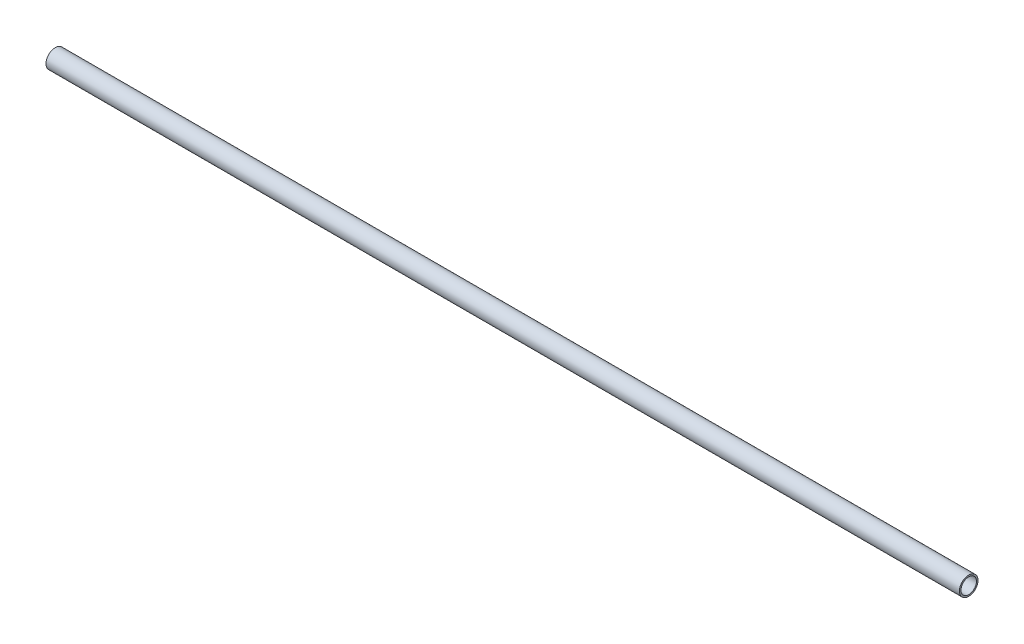
ISO-10303-21;
HEADER;
FILE_DESCRIPTION(('STEP AP214'),'2;1');
FILE_NAME('part.step','',(''),(''),'','','');
FILE_SCHEMA(('AUTOMOTIVE_DESIGN { 1 0 10303 214 1 1 1 1 }'));
ENDSEC;
DATA;
#1=APPLICATION_CONTEXT('core data for automotive mechanical design processes');
#2=APPLICATION_PROTOCOL_DEFINITION('international standard','automotive_design',2000,#1);
#3=PRODUCT_CONTEXT('',#1,'mechanical');
#4=PRODUCT('Part','Part','',(#3));
#5=PRODUCT_RELATED_PRODUCT_CATEGORY('part','',(#4));
#6=PRODUCT_DEFINITION_FORMATION('','',#4);
#7=PRODUCT_DEFINITION_CONTEXT('part definition',#1,'design');
#8=PRODUCT_DEFINITION('design','',#6,#7);
#9=PRODUCT_DEFINITION_SHAPE('','',#8);
#10=(LENGTH_UNIT() NAMED_UNIT(*) SI_UNIT(.MILLI.,.METRE.));
#11=(NAMED_UNIT(*) PLANE_ANGLE_UNIT() SI_UNIT($,.RADIAN.));
#12=(NAMED_UNIT(*) SI_UNIT($,.STERADIAN.) SOLID_ANGLE_UNIT());
#13=UNCERTAINTY_MEASURE_WITH_UNIT(LENGTH_MEASURE(1.E-05),#10,'distance_accuracy_value','');
#14=(GEOMETRIC_REPRESENTATION_CONTEXT(3) GLOBAL_UNCERTAINTY_ASSIGNED_CONTEXT((#13)) GLOBAL_UNIT_ASSIGNED_CONTEXT((#10,
#11,#12)) REPRESENTATION_CONTEXT('',''));
#15=CARTESIAN_POINT('',(0.,0.,0.));
#16=DIRECTION('',(0.,0.,1.));
#17=DIRECTION('',(1.,0.,0.));
#18=AXIS2_PLACEMENT_3D('',#15,#16,#17);
#19=CARTESIAN_POINT('',(90.,0.,0.));
#20=DIRECTION('',(1.,0.,0.));
#21=DIRECTION('',(0.,0.,-1.));
#22=AXIS2_PLACEMENT_3D('',#19,#20,#21);
#23=PLANE('',#22);
#24=CARTESIAN_POINT('',(90.,0.,0.));
#25=DIRECTION('',(1.,0.,0.));
#26=DIRECTION('',(0.,0.,-1.));
#27=AXIS2_PLACEMENT_3D('',#24,#25,#26);
#28=CIRCLE('',#27,0.9144);
#29=CARTESIAN_POINT('',(90.,0.,-0.9144));
#30=VERTEX_POINT('',#29);
#31=EDGE_CURVE('E10',#30,#30,#28,.T.);
#32=ORIENTED_EDGE('',*,*,#31,.T.);
#33=EDGE_LOOP('',(#32));
#34=FACE_BOUND('',#33,.T.);
#35=CARTESIAN_POINT('',(90.,0.,0.));
#36=DIRECTION('',(1.,0.,0.));
#37=DIRECTION('',(0.,0.,-1.));
#38=AXIS2_PLACEMENT_3D('',#35,#36,#37);
#39=CIRCLE('',#38,0.762);
#40=CARTESIAN_POINT('',(90.,0.,-0.762));
#41=VERTEX_POINT('',#40);
#42=EDGE_CURVE('E49',#41,#41,#39,.T.);
#43=ORIENTED_EDGE('',*,*,#42,.F.);
#44=EDGE_LOOP('',(#43));
#45=FACE_BOUND('',#44,.T.);
#46=ADVANCED_FACE('F31',(#34,#45),#23,.T.);
#47=CARTESIAN_POINT('',(0.,0.,0.));
#48=DIRECTION('',(1.,0.,0.));
#49=DIRECTION('',(0.,0.,-1.));
#50=AXIS2_PLACEMENT_3D('',#47,#48,#49);
#51=PLANE('',#50);
#52=CARTESIAN_POINT('',(0.,0.,0.));
#53=DIRECTION('',(1.,0.,0.));
#54=DIRECTION('',(0.,0.,-1.));
#55=AXIS2_PLACEMENT_3D('',#52,#53,#54);
#56=CIRCLE('',#55,0.9144);
#57=CARTESIAN_POINT('',(0.,0.,-0.9144));
#58=VERTEX_POINT('',#57);
#59=EDGE_CURVE('E44',#58,#58,#56,.T.);
#60=ORIENTED_EDGE('',*,*,#59,.F.);
#61=EDGE_LOOP('',(#60));
#62=FACE_BOUND('',#61,.T.);
#63=CARTESIAN_POINT('',(0.,0.,0.));
#64=DIRECTION('',(1.,0.,0.));
#65=DIRECTION('',(0.,0.,-1.));
#66=AXIS2_PLACEMENT_3D('',#63,#64,#65);
#67=CIRCLE('',#66,0.762);
#68=CARTESIAN_POINT('',(0.,0.,-0.762));
#69=VERTEX_POINT('',#68);
#70=EDGE_CURVE('E51',#69,#69,#67,.T.);
#71=ORIENTED_EDGE('',*,*,#70,.T.);
#72=EDGE_LOOP('',(#71));
#73=FACE_BOUND('',#72,.T.);
#74=ADVANCED_FACE('F71',(#62,#73),#51,.F.);
#75=CARTESIAN_POINT('',(90.,0.,0.));
#76=DIRECTION('',(-1.,0.,0.));
#77=DIRECTION('',(0.,0.,1.));
#78=AXIS2_PLACEMENT_3D('',#75,#76,#77);
#79=CYLINDRICAL_SURFACE('',#78,0.9144);
#80=CARTESIAN_POINT('',(1.19548603606049,0.,-0.914399999999998));
#81=CARTESIAN_POINT('',(1.19548355231916,0.0211826625570972,-0.914398103636516));
#82=CARTESIAN_POINT('',(1.19378023062115,0.0423945283832887,-0.913655560256976));
#83=CARTESIAN_POINT('',(1.18702939659505,0.0842135878269034,-0.910756629140818));
#84=CARTESIAN_POINT('',(1.18197357725882,0.104819146310312,-0.908596729537185));
#85=CARTESIAN_POINT('',(1.16874297152986,0.144750769355557,-0.903094276887231));
#86=CARTESIAN_POINT('',(1.16057910664216,0.164081039273562,-0.899755868013605));
#87=CARTESIAN_POINT('',(1.14141120948313,0.201077535245957,-0.892217528885541));
#88=CARTESIAN_POINT('',(1.13040790479838,0.218744186010541,-0.888017819389863));
#89=CARTESIAN_POINT('',(1.10525287110832,0.252887141648048,-0.878921356467558));
#90=CARTESIAN_POINT('',(1.09097339301122,0.269262849721512,-0.874000545845104));
#91=CARTESIAN_POINT('',(1.05994210937822,0.299474917763513,-0.864115328426974));
#92=CARTESIAN_POINT('',(1.04318890701243,0.313309833062255,-0.859150898500276));
#93=CARTESIAN_POINT('',(1.00658246520922,0.338794117285725,-0.849436362933393));
#94=CARTESIAN_POINT('',(0.986610121529142,0.350283531506629,-0.844712632292363));
#95=CARTESIAN_POINT('',(0.944782685213994,0.36969492887916,-0.836400229977703));
#96=CARTESIAN_POINT('',(0.922928651168619,0.377618902433122,-0.8328109253462));
#97=CARTESIAN_POINT('',(0.879115832030801,0.389250231639416,-0.827436415252007));
#98=CARTESIAN_POINT('',(0.857219211080218,0.393151994602268,-0.825568549147797));
#99=CARTESIAN_POINT('',(0.813008585584557,0.397233498388574,-0.823613130283137));
#100=CARTESIAN_POINT('',(0.790694849079531,0.397415552432461,-0.823524471066365));
#101=CARTESIAN_POINT('',(0.748299522079585,0.394197991992506,-0.825068142005282));
#102=CARTESIAN_POINT('',(0.728188681409377,0.391099822017095,-0.826555636720549));
#103=CARTESIAN_POINT('',(0.688807098588373,0.381918642315646,-0.830837465357416));
#104=CARTESIAN_POINT('',(0.669536535023963,0.375835001413688,-0.83363207561812));
#105=CARTESIAN_POINT('',(0.631875773917965,0.360735330016639,-0.840277599033131));
#106=CARTESIAN_POINT('',(0.613514367642152,0.351657583125733,-0.844150450203611));
#107=CARTESIAN_POINT('',(0.578500127533077,0.330871450970986,-0.852512025789293));
#108=CARTESIAN_POINT('',(0.561848001426085,0.319161982393722,-0.857001003527757));
#109=CARTESIAN_POINT('',(0.529104611222841,0.292175719760111,-0.866593259677911));
#110=CARTESIAN_POINT('',(0.513207499831032,0.276669216856914,-0.871714964349622));
#111=CARTESIAN_POINT('',(0.484171043734902,0.243164221661245,-0.881648271307386));
#112=CARTESIAN_POINT('',(0.471032458352008,0.225165045483721,-0.886459787958113));
#113=CARTESIAN_POINT('',(0.447567563893319,0.186552718764068,-0.895392666230926));
#114=CARTESIAN_POINT('',(0.437326681967174,0.165882150717417,-0.899491908281542));
#115=CARTESIAN_POINT('',(0.420536994029176,0.122888044282699,-0.90636556562821));
#116=CARTESIAN_POINT('',(0.413985969733069,0.100565508184739,-0.909140776756938));
#117=CARTESIAN_POINT('',(0.405183230754538,0.0565180036742427,-0.912901087445255));
#118=CARTESIAN_POINT('',(0.402671359822178,0.0348542657703777,-0.913994292477456));
#119=CARTESIAN_POINT('',(0.401234653456735,-0.00861129482535625,-0.914617406824769));
#120=CARTESIAN_POINT('',(0.402308673793319,-0.0304130712542647,-0.914147814816554));
#121=CARTESIAN_POINT('',(0.407832935859184,-0.0722746807942103,-0.911767290687516));
#122=CARTESIAN_POINT('',(0.412094839431562,-0.0923644830032107,-0.909936795181774));
#123=CARTESIAN_POINT('',(0.423605389779675,-0.13151840003472,-0.905107527909144));
#124=CARTESIAN_POINT('',(0.430854405349249,-0.150582387879783,-0.9021086118896));
#125=CARTESIAN_POINT('',(0.448367447151964,-0.187818495024468,-0.895109972339574));
#126=CARTESIAN_POINT('',(0.458718613285838,-0.205944126309871,-0.891081902224171));
#127=CARTESIAN_POINT('',(0.482046992033863,-0.240266552669998,-0.882447198299738));
#128=CARTESIAN_POINT('',(0.495025334794331,-0.25646251286864,-0.87784031582459));
#129=CARTESIAN_POINT('',(0.524408419546537,-0.287782151686156,-0.868100312680267));
#130=CARTESIAN_POINT('',(0.541000294570585,-0.302726615580467,-0.862954018007163));
#131=CARTESIAN_POINT('',(0.576527415786249,-0.329675457365273,-0.853022980331927));
#132=CARTESIAN_POINT('',(0.595463369997212,-0.341678943668162,-0.848238347274466));
#133=CARTESIAN_POINT('',(0.635658212739152,-0.362600600343334,-0.839511585067669));
#134=CARTESIAN_POINT('',(0.656955628051034,-0.371453074411993,-0.835587984629721));
#135=CARTESIAN_POINT('',(0.70096416122425,-0.385364923481328,-0.829265150170582));
#136=CARTESIAN_POINT('',(0.723673957915795,-0.390427787235991,-0.826864514403776));
#137=CARTESIAN_POINT('',(0.767857994923455,-0.396256551666686,-0.824085903256717));
#138=CARTESIAN_POINT('',(0.789280972839205,-0.397340589694431,-0.823558291916102));
#139=CARTESIAN_POINT('',(0.831994635096637,-0.396044871484146,-0.824182267141391));
#140=CARTESIAN_POINT('',(0.853285343571153,-0.393665766925656,-0.82533353778245));
#141=CARTESIAN_POINT('',(0.893922352696826,-0.385785751933642,-0.829043962940806));
#142=CARTESIAN_POINT('',(0.91331128368523,-0.380462942212368,-0.831522561986333));
#143=CARTESIAN_POINT('',(0.950921258100243,-0.36702917931066,-0.837538541803528));
#144=CARTESIAN_POINT('',(0.969141965869273,-0.358917429024767,-0.841076225234074));
#145=CARTESIAN_POINT('',(1.00514868386959,-0.33955226072401,-0.84908645730133));
#146=CARTESIAN_POINT('',(1.0228356988868,-0.328133664835673,-0.853603733967308));
#147=CARTESIAN_POINT('',(1.05614173621963,-0.302699778308078,-0.862950549152113));
#148=CARTESIAN_POINT('',(1.0717599437067,-0.288683469707399,-0.867780209599581));
#149=CARTESIAN_POINT('',(1.10180266011669,-0.257094466079244,-0.877681766469367));
#150=CARTESIAN_POINT('',(1.11602504516285,-0.239324653835698,-0.882741165153747));
#151=CARTESIAN_POINT('',(1.14130309057067,-0.201469001996494,-0.892142040215925));
#152=CARTESIAN_POINT('',(1.15235731419644,-0.181382117399784,-0.89648319049778));
#153=CARTESIAN_POINT('',(1.17077627752267,-0.139696719215343,-0.903910627752523));
#154=CARTESIAN_POINT('',(1.1781889416886,-0.118122352880954,-0.907013108175364));
#155=CARTESIAN_POINT('',(1.18920475434296,-0.0739056356071626,-0.911677275892102));
#156=CARTESIAN_POINT('',(1.19281964440552,-0.0512668038070313,-0.913243711168555));
#157=CARTESIAN_POINT('',(1.19514544499703,-0.01901421978873,-0.91425241780193));
#158=CARTESIAN_POINT('',(1.19548715114749,-0.00951005300273396,-0.914400851381036));
#159=CARTESIAN_POINT('',(1.19548603606049,0.,-0.914399999999998));
#160=B_SPLINE_CURVE_WITH_KNOTS('',3,(#80,#81,#82,#83,#84,#85,#86,#87,#88,#89,#90,#91,#92,#93,
#94,#95,#96,#97,#98,#99,#100,#101,#102,#103,#104,#105,#106,#107,#108,#109,#110,#111,#112,#113,
#114,#115,#116,#117,#118,#119,#120,#121,#122,#123,#124,#125,#126,#127,#128,#129,#130,#131,#132,
#133,#134,#135,#136,#137,#138,#139,#140,#141,#142,#143,#144,#145,#146,#147,#148,#149,#150,#151,
#152,#153,#154,#155,#156,#157,#158,#159),.UNSPECIFIED.,.T.,.F.,(4,2,2,2,2,2,2,2,2,2,2,2,2,2,2,2,
2,2,2,2,2,2,2,2,2,2,2,2,2,2,2,2,2,2,2,2,2,2,2,4),(0.,0.0635192722105536,0.127196527159707,
0.190652058647002,0.254091346216639,0.320635949152084,0.38721827233628,0.457424811152419,
0.527592108491387,0.594181490169864,0.660729459841864,0.721652375103257,0.782588175988002,
0.844867956363841,0.907173420494807,0.975238601077157,1.04332249302416,1.11324305810109,
1.18312154304685,1.24828730279063,1.31343227062909,1.37500550620097,1.43658634598611,
1.50009158543444,1.56362420154057,1.63205992183444,1.70051636352088,1.77032634309286,
1.84007197557144,1.90410190477779,1.96811978666004,2.02863173698812,2.08916099659792,
2.15348786151267,2.21783998759455,2.28745567400255,2.35710288079437,2.42580715805349,
2.49429839160575,2.52281565867683),.UNSPECIFIED.);
#161=CARTESIAN_POINT('',(1.19548603606049,0.,-0.914399999999998));
#162=VERTEX_POINT('',#161);
#163=EDGE_CURVE('E54',#162,#162,#160,.T.);
#164=ORIENTED_EDGE('',*,*,#163,.T.);
#165=EDGE_LOOP('',(#164));
#166=FACE_BOUND('',#165,.T.);
#167=ORIENTED_EDGE('',*,*,#31,.F.);
#168=EDGE_LOOP('',(#167));
#169=FACE_BOUND('',#168,.T.);
#170=ORIENTED_EDGE('',*,*,#59,.T.);
#171=EDGE_LOOP('',(#170));
#172=FACE_BOUND('',#171,.T.);
#173=ADVANCED_FACE('F33',(#166,#169,#172),#79,.T.);
#174=CARTESIAN_POINT('',(90.,0.,0.));
#175=DIRECTION('',(-1.,0.,0.));
#176=DIRECTION('',(0.,0.,1.));
#177=AXIS2_PLACEMENT_3D('',#174,#175,#176);
#178=CYLINDRICAL_SURFACE('',#177,0.762);
#179=CARTESIAN_POINT('',(1.19548603606049,0.,-0.761999999999998));
#180=CARTESIAN_POINT('',(1.19548468654292,0.0207588049080754,-0.761998807884079));
#181=CARTESIAN_POINT('',(1.19384781076727,0.0415391645751463,-0.761142798486304));
#182=CARTESIAN_POINT('',(1.18737588860164,0.0824790411530542,-0.757802720707897));
#183=CARTESIAN_POINT('',(1.18253545839982,0.102637453042879,-0.755315911711517));
#184=CARTESIAN_POINT('',(1.16990048365216,0.141680126383081,-0.748972932088286));
#185=CARTESIAN_POINT('',(1.16211772520889,0.160569121786206,-0.745122228656363));
#186=CARTESIAN_POINT('',(1.14388370811137,0.196741498843767,-0.73639898968104));
#187=CARTESIAN_POINT('',(1.13343251832903,0.214024921922147,-0.731526480510913));
#188=CARTESIAN_POINT('',(1.10940087923524,0.247739883164685,-0.720833828818903));
#189=CARTESIAN_POINT('',(1.0956629249461,0.264046038605577,-0.714972988248747));
#190=CARTESIAN_POINT('',(1.06578948813302,0.294239896764392,-0.703086536328311));
#191=CARTESIAN_POINT('',(1.04965203103317,0.308125587017644,-0.697060792641599));
#192=CARTESIAN_POINT('',(1.01377963936565,0.334284708642708,-0.68492561154829));
#193=CARTESIAN_POINT('',(0.9938547299539,0.346317057347319,-0.678853478556028));
#194=CARTESIAN_POINT('',(0.951919706960857,0.366810079325601,-0.668004229794053));
#195=CARTESIAN_POINT('',(0.929911180727179,0.3752734451454,-0.663226138738063));
#196=CARTESIAN_POINT('',(0.885806087919432,0.387813118517187,-0.655968695224201));
#197=CARTESIAN_POINT('',(0.863798785620187,0.392127945850591,-0.653365670918845));
#198=CARTESIAN_POINT('',(0.819231937535684,0.396970236192993,-0.650436483099856));
#199=CARTESIAN_POINT('',(0.796673057310679,0.397502057583105,-0.650107699457652));
#200=CARTESIAN_POINT('',(0.754864622677315,0.394937537447022,-0.651666430142653));
#201=CARTESIAN_POINT('',(0.735572639401381,0.392312600468381,-0.653266051243493));
#202=CARTESIAN_POINT('',(0.69775646988202,0.384332852315526,-0.657992062712736));
#203=CARTESIAN_POINT('',(0.679232568686005,0.378977037302497,-0.661119014492235));
#204=CARTESIAN_POINT('',(0.642950775907147,0.365598660405816,-0.668611423621939));
#205=CARTESIAN_POINT('',(0.625220170207228,0.357517793460604,-0.673003623390467));
#206=CARTESIAN_POINT('',(0.591278380251526,0.338965273737246,-0.682535876973434));
#207=CARTESIAN_POINT('',(0.575067881075655,0.328492550235102,-0.687676265342517));
#208=CARTESIAN_POINT('',(0.542251913533663,0.303757389822866,-0.698988456674222));
#209=CARTESIAN_POINT('',(0.525905356422313,0.289170396470084,-0.705204249857132));
#210=CARTESIAN_POINT('',(0.495777292663262,0.25744961346679,-0.717392869927746));
#211=CARTESIAN_POINT('',(0.481997217806492,0.240314411748947,-0.72336555974957));
#212=CARTESIAN_POINT('',(0.456681821867955,0.202812566470285,-0.734789264998665));
#213=CARTESIAN_POINT('',(0.445309203285494,0.182320911983716,-0.740194286168294));
#214=CARTESIAN_POINT('',(0.426269606799834,0.139363593057455,-0.749468454826347));
#215=CARTESIAN_POINT('',(0.418599457176573,0.116899637759161,-0.753338916385628));
#216=CARTESIAN_POINT('',(0.407855736746741,0.072736236325871,-0.75881792439733));
#217=CARTESIAN_POINT('',(0.404439293166463,0.0511412992778644,-0.760594461441939));
#218=CARTESIAN_POINT('',(0.401210470327129,0.00761534664683685,-0.7622724590641));
#219=CARTESIAN_POINT('',(0.401396157132105,-0.0143154822807393,-0.762174925805376));
#220=CARTESIAN_POINT('',(0.405184550432535,-0.0558889526976419,-0.760208275827147));
#221=CARTESIAN_POINT('',(0.408493319273637,-0.0755667338523759,-0.758491562885516));
#222=CARTESIAN_POINT('',(0.417958296770446,-0.114043304300495,-0.753667170014738));
#223=CARTESIAN_POINT('',(0.42411480803722,-0.132841999945364,-0.750559342262001));
#224=CARTESIAN_POINT('',(0.439239545190798,-0.169610503816278,-0.743126950417991));
#225=CARTESIAN_POINT('',(0.448277966558069,-0.187545138933752,-0.738772321707799));
#226=CARTESIAN_POINT('',(0.468827194526668,-0.221698126336717,-0.729252184301557));
#227=CARTESIAN_POINT('',(0.480339004984063,-0.237915777761473,-0.724086346595918));
#228=CARTESIAN_POINT('',(0.506887752403491,-0.269971052076759,-0.712795618555093));
#229=CARTESIAN_POINT('',(0.52216708052289,-0.285592776476978,-0.706626890448452));
#230=CARTESIAN_POINT('',(0.555113038815357,-0.314156695358316,-0.694400080343265));
#231=CARTESIAN_POINT('',(0.572781648416488,-0.327096645338803,-0.688342094865408));
#232=CARTESIAN_POINT('',(0.611321457128008,-0.35067431277241,-0.676649895932403));
#233=CARTESIAN_POINT('',(0.632321122220844,-0.361127605476311,-0.671062830091485));
#234=CARTESIAN_POINT('',(0.676159910499196,-0.378242179710622,-0.661569271274703));
#235=CARTESIAN_POINT('',(0.698996441514143,-0.384908701530609,-0.657660457703201));
#236=CARTESIAN_POINT('',(0.743485477711312,-0.39361553703428,-0.652483125374895));
#237=CARTESIAN_POINT('',(0.765035458027504,-0.396044423192252,-0.650993833072841));
#238=CARTESIAN_POINT('',(0.808277837364903,-0.397345413966033,-0.65020121987123));
#239=CARTESIAN_POINT('',(0.829970147445655,-0.396219561328325,-0.650896643513774));
#240=CARTESIAN_POINT('',(0.870323237300291,-0.390813396223624,-0.654153367923028));
#241=CARTESIAN_POINT('',(0.889052803834841,-0.386897941647598,-0.656498488810476));
#242=CARTESIAN_POINT('',(0.925560167868052,-0.376502516440717,-0.662514680361707));
#243=CARTESIAN_POINT('',(0.943337631378198,-0.370021652492458,-0.66618621286472));
#244=CARTESIAN_POINT('',(0.978742262118415,-0.354207607630173,-0.674734462623545));
#245=CARTESIAN_POINT('',(0.996282145202306,-0.344714463668869,-0.679674707504006));
#246=CARTESIAN_POINT('',(1.02963699059951,-0.323310903006898,-0.690112907215584));
#247=CARTESIAN_POINT('',(1.04545102045294,-0.311399189423,-0.695611160466962));
#248=CARTESIAN_POINT('',(1.07714251384326,-0.28360587825903,-0.70743857732832));
#249=CARTESIAN_POINT('',(1.09273713242909,-0.267404872790391,-0.713779209522475));
#250=CARTESIAN_POINT('',(1.12106376113547,-0.232464729524475,-0.725910472873333));
#251=CARTESIAN_POINT('',(1.13379404955851,-0.213724075975323,-0.731700772033516));
#252=CARTESIAN_POINT('',(1.1561769346718,-0.173752576834564,-0.742218480160977));
#253=CARTESIAN_POINT('',(1.16577283100086,-0.152484445258881,-0.746925895156206));
#254=CARTESIAN_POINT('',(1.18112240481958,-0.108339681764942,-0.754588938127498));
#255=CARTESIAN_POINT('',(1.18688661074872,-0.0854676499593578,-0.757549363816197));
#256=CARTESIAN_POINT('',(1.19220970619991,-0.0519477235418048,-0.760297764593271));
#257=CARTESIAN_POINT('',(1.19343624985018,-0.041608709103759,-0.760934112854043));
#258=CARTESIAN_POINT('',(1.19507476278655,-0.0208482770246435,-0.761785534647062));
#259=CARTESIAN_POINT('',(1.19548671390431,-0.0104268575508506,-0.762000598783162));
#260=CARTESIAN_POINT('',(1.19548603606049,0.,-0.761999999999998));
#261=B_SPLINE_CURVE_WITH_KNOTS('',3,(#179,#180,#181,#182,#183,#184,#185,#186,#187,#188,#189,
#190,#191,#192,#193,#194,#195,#196,#197,#198,#199,#200,#201,#202,#203,#204,#205,#206,#207,#208,
#209,#210,#211,#212,#213,#214,#215,#216,#217,#218,#219,#220,#221,#222,#223,#224,#225,#226,#227,
#228,#229,#230,#231,#232,#233,#234,#235,#236,#237,#238,#239,#240,#241,#242,#243,#244,#245,#246,
#247,#248,#249,#250,#251,#252,#253,#254,#255,#256,#257,#258,#259,#260),.UNSPECIFIED.,.T.,.F.,(4,
2,2,2,2,2,2,2,2,2,2,2,2,2,2,2,2,2,2,2,2,2,2,2,2,2,2,2,2,2,2,2,2,2,2,2,2,2,2,2,4),(0.,
0.0622342614448561,0.124573378688792,0.186665385042572,0.248755788970499,0.314821380552843,
0.380941642203812,0.452743780185935,0.524491651180665,0.591811446673549,0.659053670806288,
0.71738611222965,0.775740011450765,0.83543130430023,0.895149370749038,0.963177087480254,
1.03124264262109,1.10300746717696,1.17471070481046,1.24015319585031,1.30556055265869,
1.36536751919545,1.42518084249011,1.48657942228278,1.54800296869315,1.61583034546547,
1.6837142628665,1.75566605410644,1.82751803138947,1.89234518776847,1.95713509771495,
2.01471731952054,2.07231961005885,2.1337219433741,2.19515728916158,2.26493297900054,
2.33475049837349,2.40576883806708,2.47659122312191,2.50784992559813,2.53910932524765),.UNSPECIFIED.);
#262=CARTESIAN_POINT('',(1.19548603606049,0.,-0.761999999999998));
#263=VERTEX_POINT('',#262);
#264=EDGE_CURVE('E36',#263,#263,#261,.T.);
#265=ORIENTED_EDGE('',*,*,#264,.F.);
#266=EDGE_LOOP('',(#265));
#267=FACE_BOUND('',#266,.T.);
#268=ORIENTED_EDGE('',*,*,#42,.T.);
#269=EDGE_LOOP('',(#268));
#270=FACE_BOUND('',#269,.T.);
#271=ORIENTED_EDGE('',*,*,#70,.F.);
#272=EDGE_LOOP('',(#271));
#273=FACE_BOUND('',#272,.T.);
#274=ADVANCED_FACE('F63',(#267,#270,#273),#178,.F.);
#275=CARTESIAN_POINT('',(0.798611036060493,0.,-10.));
#276=DIRECTION('',(0.,0.,1.));
#277=DIRECTION('',(1.,0.,0.));
#278=AXIS2_PLACEMENT_3D('',#275,#276,#277);
#279=CYLINDRICAL_SURFACE('',#278,0.396875);
#280=ORIENTED_EDGE('',*,*,#264,.T.);
#281=EDGE_LOOP('',(#280));
#282=FACE_BOUND('',#281,.T.);
#283=ORIENTED_EDGE('',*,*,#163,.F.);
#284=EDGE_LOOP('',(#283));
#285=FACE_BOUND('',#284,.T.);
#286=ADVANCED_FACE('F60',(#282,#285),#279,.F.);
#287=CLOSED_SHELL('',(#46,#74,#173,#274,#286));
#288=MANIFOLD_SOLID_BREP('B2',#287);
#289=ADVANCED_BREP_SHAPE_REPRESENTATION('',(#18,#288),#14);
#290=SHAPE_DEFINITION_REPRESENTATION(#9,#289);
ENDSEC;
END-ISO-10303-21;
